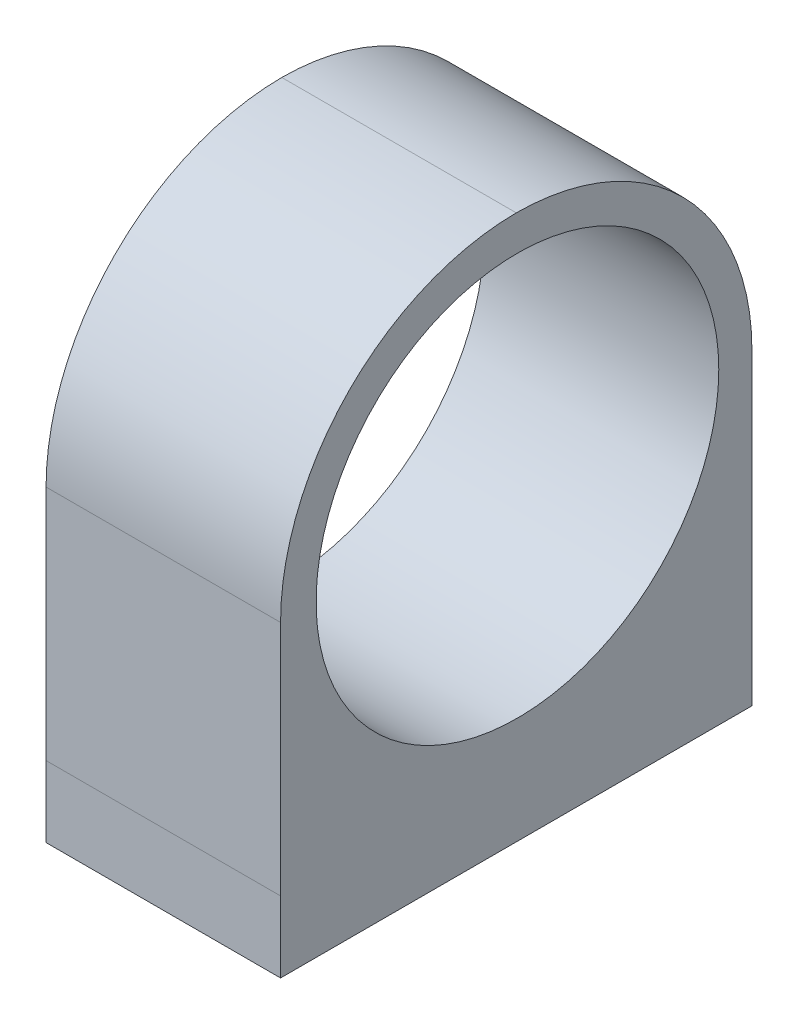
ISO-10303-21;
HEADER;
FILE_DESCRIPTION(('STEP AP214'),'2;1');
FILE_NAME('part.step','',(''),(''),'','','');
FILE_SCHEMA(('AUTOMOTIVE_DESIGN { 1 0 10303 214 1 1 1 1 }'));
ENDSEC;
DATA;
#1=APPLICATION_CONTEXT('core data for automotive mechanical design processes');
#2=APPLICATION_PROTOCOL_DEFINITION('international standard','automotive_design',2000,#1);
#3=PRODUCT_CONTEXT('',#1,'mechanical');
#4=PRODUCT('Part','Part','',(#3));
#5=PRODUCT_RELATED_PRODUCT_CATEGORY('part','',(#4));
#6=PRODUCT_DEFINITION_FORMATION('','',#4);
#7=PRODUCT_DEFINITION_CONTEXT('part definition',#1,'design');
#8=PRODUCT_DEFINITION('design','',#6,#7);
#9=PRODUCT_DEFINITION_SHAPE('','',#8);
#10=(LENGTH_UNIT() NAMED_UNIT(*) SI_UNIT(.MILLI.,.METRE.));
#11=(NAMED_UNIT(*) PLANE_ANGLE_UNIT() SI_UNIT($,.RADIAN.));
#12=(NAMED_UNIT(*) SI_UNIT($,.STERADIAN.) SOLID_ANGLE_UNIT());
#13=UNCERTAINTY_MEASURE_WITH_UNIT(LENGTH_MEASURE(1.E-05),#10,'distance_accuracy_value','');
#14=(GEOMETRIC_REPRESENTATION_CONTEXT(3) GLOBAL_UNCERTAINTY_ASSIGNED_CONTEXT((#13)) GLOBAL_UNIT_ASSIGNED_CONTEXT((#10,
#11,#12)) REPRESENTATION_CONTEXT('',''));
#15=CARTESIAN_POINT('',(0.,0.,0.));
#16=DIRECTION('',(0.,0.,1.));
#17=DIRECTION('',(1.,0.,0.));
#18=AXIS2_PLACEMENT_3D('',#15,#16,#17);
#19=CARTESIAN_POINT('',(-49.5,30.,99.5));
#20=DIRECTION('',(1.,0.,0.));
#21=DIRECTION('',(0.,0.,-1.));
#22=AXIS2_PLACEMENT_3D('',#19,#20,#21);
#23=PLANE('',#22);
#24=CARTESIAN_POINT('',(-49.5,130.,-0.502153180369919));
#25=DIRECTION('',(1.,0.,0.));
#26=DIRECTION('',(0.,0.,-1.));
#27=AXIS2_PLACEMENT_3D('',#24,#25,#26);
#28=CIRCLE('',#27,85.);
#29=CARTESIAN_POINT('',(-49.5,130.,-85.50215318037));
#30=VERTEX_POINT('',#29);
#31=EDGE_CURVE('E252',#30,#30,#28,.T.);
#32=ORIENTED_EDGE('',*,*,#31,.T.);
#33=EDGE_LOOP('',(#32));
#34=FACE_BOUND('',#33,.T.);
#35=CARTESIAN_POINT('',(-49.5,130.,-0.502153180369919));
#36=DIRECTION('',(1.,0.,0.));
#37=DIRECTION('',(0.,0.,-1.));
#38=AXIS2_PLACEMENT_3D('',#35,#36,#37);
#39=CIRCLE('',#38,100.);
#40=CARTESIAN_POINT('',(-49.5,130.,99.4978468196301));
#41=VERTEX_POINT('',#40);
#42=CARTESIAN_POINT('',(-49.5,229.998739202969,0.));
#43=VERTEX_POINT('',#42);
#44=EDGE_CURVE('E177',#41,#43,#39,.F.);
#45=ORIENTED_EDGE('',*,*,#44,.T.);
#46=CARTESIAN_POINT('',(-49.5,130.,0.502153180369919));
#47=DIRECTION('',(1.,0.,0.));
#48=DIRECTION('',(0.,0.,-1.));
#49=AXIS2_PLACEMENT_3D('',#46,#47,#48);
#50=CIRCLE('',#49,100.);
#51=CARTESIAN_POINT('',(-49.5,130.,-99.4978468196301));
#52=VERTEX_POINT('',#51);
#53=EDGE_CURVE('E106',#43,#52,#50,.F.);
#54=ORIENTED_EDGE('',*,*,#53,.T.);
#55=DIRECTION('',(0.,-1.,0.));
#56=VECTOR('',#55,1.);
#57=CARTESIAN_POINT('',(-49.5,230.,-99.4978468196301));
#58=LINE('',#57,#56);
#59=CARTESIAN_POINT('',(-49.5,30.,-99.498923409815));
#60=VERTEX_POINT('',#59);
#61=EDGE_CURVE('E100',#52,#60,#58,.T.);
#62=ORIENTED_EDGE('',*,*,#61,.T.);
#63=DIRECTION('',(0.,-1.,0.));
#64=VECTOR('',#63,1.);
#65=CARTESIAN_POINT('',(-49.5,30.,-99.5));
#66=LINE('',#65,#64);
#67=CARTESIAN_POINT('',(-49.5,0.,-99.5));
#68=VERTEX_POINT('',#67);
#69=EDGE_CURVE('E103',#60,#68,#66,.T.);
#70=ORIENTED_EDGE('',*,*,#69,.T.);
#71=DIRECTION('',(0.,0.,1.));
#72=VECTOR('',#71,1.);
#73=CARTESIAN_POINT('',(-49.5,0.,99.5));
#74=LINE('',#73,#72);
#75=CARTESIAN_POINT('',(-49.5,0.,99.5));
#76=VERTEX_POINT('',#75);
#77=EDGE_CURVE('E173',#68,#76,#74,.T.);
#78=ORIENTED_EDGE('',*,*,#77,.T.);
#79=DIRECTION('',(0.,-1.,0.));
#80=VECTOR('',#79,1.);
#81=CARTESIAN_POINT('',(-49.5,30.,99.5));
#82=LINE('',#81,#80);
#83=CARTESIAN_POINT('',(-49.5,30.,99.498923409815));
#84=VERTEX_POINT('',#83);
#85=EDGE_CURVE('E201',#84,#76,#82,.T.);
#86=ORIENTED_EDGE('',*,*,#85,.F.);
#87=DIRECTION('',(0.,-1.,0.));
#88=VECTOR('',#87,1.);
#89=CARTESIAN_POINT('',(-49.5,230.,99.4978468196301));
#90=LINE('',#89,#88);
#91=EDGE_CURVE('E170',#41,#84,#90,.T.);
#92=ORIENTED_EDGE('',*,*,#91,.F.);
#93=EDGE_LOOP('',(#45,#54,#62,#70,#78,#86,#92));
#94=FACE_BOUND('',#93,.T.);
#95=ADVANCED_FACE('F43',(#34,#94),#23,.F.);
#96=CARTESIAN_POINT('',(49.5,30.,99.5));
#97=DIRECTION('',(0.,0.,-1.));
#98=DIRECTION('',(-1.,0.,0.));
#99=AXIS2_PLACEMENT_3D('',#96,#97,#98);
#100=PLANE('',#99);
#101=DIRECTION('',(1.,0.,0.));
#102=VECTOR('',#101,1.);
#103=CARTESIAN_POINT('',(49.5,0.,99.5));
#104=LINE('',#103,#102);
#105=CARTESIAN_POINT('',(49.5,0.,99.5));
#106=VERTEX_POINT('',#105);
#107=EDGE_CURVE('E183',#76,#106,#104,.T.);
#108=ORIENTED_EDGE('',*,*,#107,.T.);
#109=DIRECTION('',(0.,-1.,0.));
#110=VECTOR('',#109,1.);
#111=CARTESIAN_POINT('',(49.5,30.,99.5));
#112=LINE('',#111,#110);
#113=CARTESIAN_POINT('',(49.5,30.,99.498923409815));
#114=VERTEX_POINT('',#113);
#115=EDGE_CURVE('E242',#114,#106,#112,.T.);
#116=ORIENTED_EDGE('',*,*,#115,.F.);
#117=CARTESIAN_POINT('',(-49.5,30.0000000000001,99.4978468196301));
#118=DIRECTION('',(1.,0.,0.));
#119=VECTOR('',#118,1.);
#120=LINE('',#117,#119);
#121=EDGE_CURVE('E129',#84,#114,#120,.T.);
#122=ORIENTED_EDGE('',*,*,#121,.F.);
#123=ORIENTED_EDGE('',*,*,#85,.T.);
#124=EDGE_LOOP('',(#108,#116,#122,#123));
#125=FACE_BOUND('',#124,.T.);
#126=ADVANCED_FACE('F203',(#125),#100,.F.);
#127=CARTESIAN_POINT('',(49.5,30.,99.5));
#128=DIRECTION('',(-1.,0.,0.));
#129=DIRECTION('',(0.,0.,1.));
#130=AXIS2_PLACEMENT_3D('',#127,#128,#129);
#131=PLANE('',#130);
#132=CARTESIAN_POINT('',(49.5,130.,-0.502153180369919));
#133=DIRECTION('',(1.,0.,0.));
#134=DIRECTION('',(0.,0.,-1.));
#135=AXIS2_PLACEMENT_3D('',#132,#133,#134);
#136=CIRCLE('',#135,85.);
#137=CARTESIAN_POINT('',(49.5,130.,-85.50215318037));
#138=VERTEX_POINT('',#137);
#139=EDGE_CURVE('E255',#138,#138,#136,.T.);
#140=ORIENTED_EDGE('',*,*,#139,.F.);
#141=EDGE_LOOP('',(#140));
#142=FACE_BOUND('',#141,.T.);
#143=DIRECTION('',(0.,-1.,0.));
#144=VECTOR('',#143,1.);
#145=CARTESIAN_POINT('',(49.5,230.,-99.4978468196301));
#146=LINE('',#145,#144);
#147=CARTESIAN_POINT('',(49.5,130.,-99.4978468196301));
#148=VERTEX_POINT('',#147);
#149=CARTESIAN_POINT('',(49.5,30.,-99.4989234098151));
#150=VERTEX_POINT('',#149);
#151=EDGE_CURVE('E112',#148,#150,#146,.T.);
#152=ORIENTED_EDGE('',*,*,#151,.F.);
#153=CARTESIAN_POINT('',(49.5,130.,0.502153180369919));
#154=DIRECTION('',(-1.,0.,0.));
#155=DIRECTION('',(0.,0.,1.));
#156=AXIS2_PLACEMENT_3D('',#153,#154,#155);
#157=CIRCLE('',#156,100.);
#158=CARTESIAN_POINT('',(49.5,229.998739202969,0.));
#159=VERTEX_POINT('',#158);
#160=EDGE_CURVE('E53',#148,#159,#157,.F.);
#161=ORIENTED_EDGE('',*,*,#160,.T.);
#162=CARTESIAN_POINT('',(49.5,130.,-0.502153180369919));
#163=DIRECTION('',(-1.,0.,0.));
#164=DIRECTION('',(0.,0.,1.));
#165=AXIS2_PLACEMENT_3D('',#162,#163,#164);
#166=CIRCLE('',#165,100.);
#167=CARTESIAN_POINT('',(49.5,130.,99.4978468196301));
#168=VERTEX_POINT('',#167);
#169=EDGE_CURVE('E63',#159,#168,#166,.F.);
#170=ORIENTED_EDGE('',*,*,#169,.T.);
#171=DIRECTION('',(0.,-1.,0.));
#172=VECTOR('',#171,1.);
#173=CARTESIAN_POINT('',(49.5,230.,99.4978468196301));
#174=LINE('',#173,#172);
#175=EDGE_CURVE('E174',#168,#114,#174,.T.);
#176=ORIENTED_EDGE('',*,*,#175,.T.);
#177=ORIENTED_EDGE('',*,*,#115,.T.);
#178=DIRECTION('',(0.,0.,-1.));
#179=VECTOR('',#178,1.);
#180=CARTESIAN_POINT('',(49.5,0.,99.5));
#181=LINE('',#180,#179);
#182=CARTESIAN_POINT('',(49.5,0.,-99.5));
#183=VERTEX_POINT('',#182);
#184=EDGE_CURVE('E186',#106,#183,#181,.T.);
#185=ORIENTED_EDGE('',*,*,#184,.T.);
#186=DIRECTION('',(0.,-1.,0.));
#187=VECTOR('',#186,1.);
#188=CARTESIAN_POINT('',(49.5,30.,-99.5));
#189=LINE('',#188,#187);
#190=EDGE_CURVE('E123',#150,#183,#189,.T.);
#191=ORIENTED_EDGE('',*,*,#190,.F.);
#192=EDGE_LOOP('',(#152,#161,#170,#176,#177,#185,#191));
#193=FACE_BOUND('',#192,.T.);
#194=ADVANCED_FACE('F213',(#142,#193),#131,.F.);
#195=CARTESIAN_POINT('',(49.5,30.,-99.5));
#196=DIRECTION('',(0.,0.,1.));
#197=DIRECTION('',(1.,0.,0.));
#198=AXIS2_PLACEMENT_3D('',#195,#196,#197);
#199=PLANE('',#198);
#200=DIRECTION('',(-1.,0.,0.));
#201=VECTOR('',#200,1.);
#202=CARTESIAN_POINT('',(49.5,0.,-99.5));
#203=LINE('',#202,#201);
#204=EDGE_CURVE('E121',#183,#68,#203,.T.);
#205=ORIENTED_EDGE('',*,*,#204,.T.);
#206=ORIENTED_EDGE('',*,*,#69,.F.);
#207=CARTESIAN_POINT('',(49.5,30.,-99.4978468196301));
#208=DIRECTION('',(-1.,0.,0.));
#209=VECTOR('',#208,1.);
#210=LINE('',#207,#209);
#211=EDGE_CURVE('E118',#150,#60,#210,.T.);
#212=ORIENTED_EDGE('',*,*,#211,.F.);
#213=ORIENTED_EDGE('',*,*,#190,.T.);
#214=EDGE_LOOP('',(#205,#206,#212,#213));
#215=FACE_BOUND('',#214,.T.);
#216=ADVANCED_FACE('F116',(#215),#199,.F.);
#217=CARTESIAN_POINT('',(0.,0.,0.));
#218=DIRECTION('',(0.,1.,0.));
#219=DIRECTION('',(0.,0.,1.));
#220=AXIS2_PLACEMENT_3D('',#217,#218,#219);
#221=PLANE('',#220);
#222=ORIENTED_EDGE('',*,*,#77,.F.);
#223=ORIENTED_EDGE('',*,*,#204,.F.);
#224=ORIENTED_EDGE('',*,*,#184,.F.);
#225=ORIENTED_EDGE('',*,*,#107,.F.);
#226=EDGE_LOOP('',(#222,#223,#224,#225));
#227=FACE_BOUND('',#226,.T.);
#228=ADVANCED_FACE('F154',(#227),#221,.F.);
#229=CARTESIAN_POINT('',(49.5,230.,99.4978468196301));
#230=DIRECTION('',(0.,0.,-1.));
#231=DIRECTION('',(-1.,0.,0.));
#232=AXIS2_PLACEMENT_3D('',#229,#230,#231);
#233=PLANE('',#232);
#234=ORIENTED_EDGE('',*,*,#175,.F.);
#235=DIRECTION('',(1.,0.,0.));
#236=VECTOR('',#235,1.);
#237=CARTESIAN_POINT('',(-49.5,130.,99.4978468196301));
#238=LINE('',#237,#236);
#239=EDGE_CURVE('E11',#168,#41,#238,.F.);
#240=ORIENTED_EDGE('',*,*,#239,.T.);
#241=ORIENTED_EDGE('',*,*,#91,.T.);
#242=ORIENTED_EDGE('',*,*,#121,.T.);
#243=EDGE_LOOP('',(#234,#240,#241,#242));
#244=FACE_BOUND('',#243,.T.);
#245=ADVANCED_FACE('F149',(#244),#233,.F.);
#246=CARTESIAN_POINT('',(49.5,230.,-99.4978468196301));
#247=DIRECTION('',(0.,0.,1.));
#248=DIRECTION('',(1.,0.,0.));
#249=AXIS2_PLACEMENT_3D('',#246,#247,#248);
#250=PLANE('',#249);
#251=ORIENTED_EDGE('',*,*,#61,.F.);
#252=DIRECTION('',(-1.,0.,0.));
#253=VECTOR('',#252,1.);
#254=CARTESIAN_POINT('',(49.5,130.,-99.4978468196301));
#255=LINE('',#254,#253);
#256=EDGE_CURVE('E226',#52,#148,#255,.F.);
#257=ORIENTED_EDGE('',*,*,#256,.T.);
#258=ORIENTED_EDGE('',*,*,#151,.T.);
#259=ORIENTED_EDGE('',*,*,#211,.T.);
#260=EDGE_LOOP('',(#251,#257,#258,#259));
#261=FACE_BOUND('',#260,.T.);
#262=ADVANCED_FACE('F126',(#261),#250,.F.);
#263=CARTESIAN_POINT('',(0.,130.,-0.502153180369919));
#264=DIRECTION('',(-1.,0.,0.));
#265=DIRECTION('',(0.,0.,1.));
#266=AXIS2_PLACEMENT_3D('',#263,#264,#265);
#267=CYLINDRICAL_SURFACE('',#266,100.);
#268=ORIENTED_EDGE('',*,*,#239,.F.);
#269=ORIENTED_EDGE('',*,*,#169,.F.);
#270=DIRECTION('',(-1.,0.,0.));
#271=VECTOR('',#270,1.);
#272=CARTESIAN_POINT('',(0.,229.998739202969,0.));
#273=LINE('',#272,#271);
#274=EDGE_CURVE('E47',#43,#159,#273,.F.);
#275=ORIENTED_EDGE('',*,*,#274,.F.);
#276=ORIENTED_EDGE('',*,*,#44,.F.);
#277=EDGE_LOOP('',(#268,#269,#275,#276));
#278=FACE_BOUND('',#277,.T.);
#279=ADVANCED_FACE('F45',(#278),#267,.T.);
#280=CARTESIAN_POINT('',(0.,130.,0.502153180369919));
#281=DIRECTION('',(1.,0.,0.));
#282=DIRECTION('',(0.,0.,-1.));
#283=AXIS2_PLACEMENT_3D('',#280,#281,#282);
#284=CYLINDRICAL_SURFACE('',#283,100.);
#285=ORIENTED_EDGE('',*,*,#160,.F.);
#286=ORIENTED_EDGE('',*,*,#256,.F.);
#287=ORIENTED_EDGE('',*,*,#53,.F.);
#288=ORIENTED_EDGE('',*,*,#274,.T.);
#289=EDGE_LOOP('',(#285,#286,#287,#288));
#290=FACE_BOUND('',#289,.T.);
#291=ADVANCED_FACE('F216',(#290),#284,.T.);
#292=CARTESIAN_POINT('',(-49.5,130.,-0.502153180369919));
#293=DIRECTION('',(1.,0.,0.));
#294=DIRECTION('',(0.,0.,-1.));
#295=AXIS2_PLACEMENT_3D('',#292,#293,#294);
#296=CYLINDRICAL_SURFACE('',#295,85.);
#297=ORIENTED_EDGE('',*,*,#31,.F.);
#298=EDGE_LOOP('',(#297));
#299=FACE_BOUND('',#298,.T.);
#300=ORIENTED_EDGE('',*,*,#139,.T.);
#301=EDGE_LOOP('',(#300));
#302=FACE_BOUND('',#301,.T.);
#303=ADVANCED_FACE('F150',(#299,#302),#296,.F.);
#304=CLOSED_SHELL('',(#95,#126,#194,#216,#228,#245,#262,#279,#291,#303));
#305=MANIFOLD_SOLID_BREP('B2',#304);
#306=ADVANCED_BREP_SHAPE_REPRESENTATION('',(#18,#305),#14);
#307=SHAPE_DEFINITION_REPRESENTATION(#9,#306);
ENDSEC;
END-ISO-10303-21;
